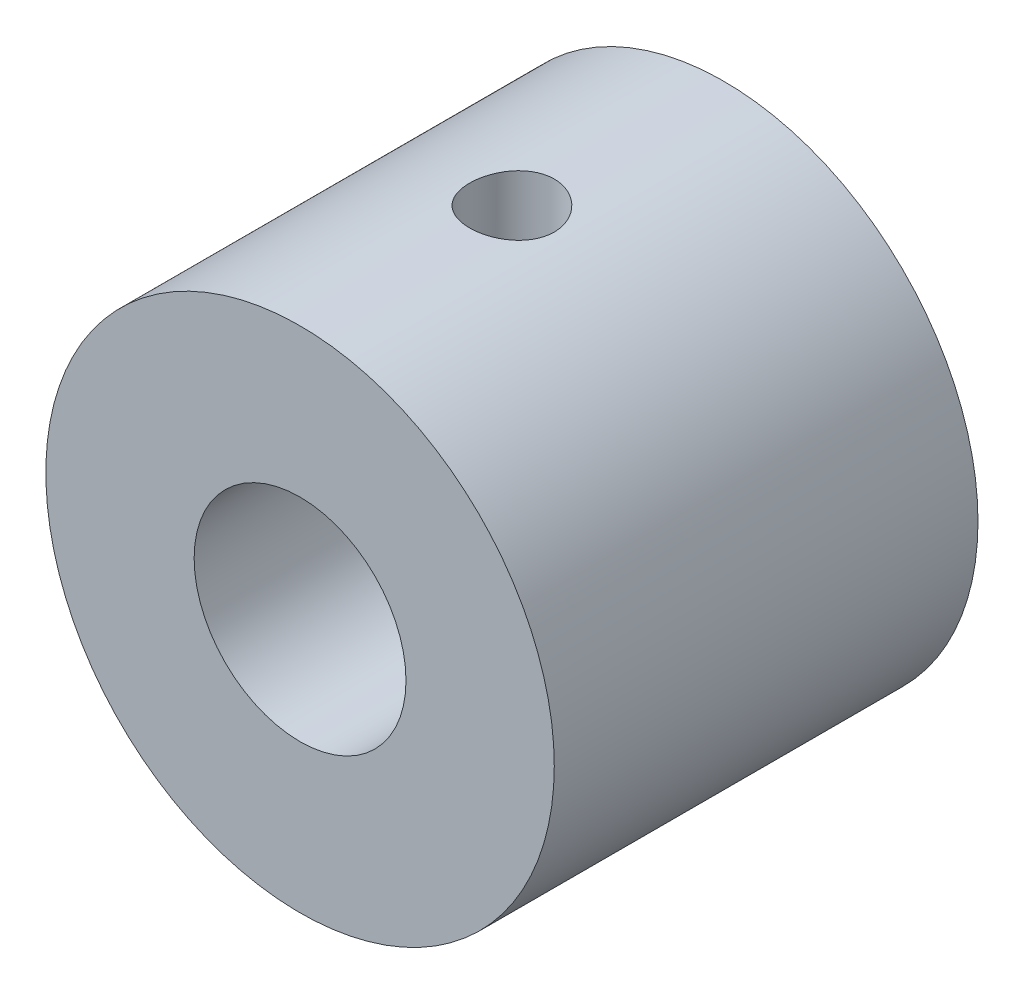
ISO-10303-21;
HEADER;
FILE_DESCRIPTION(('STEP AP214'),'2;1');
FILE_NAME('part.step','',(''),(''),'','','');
FILE_SCHEMA(('AUTOMOTIVE_DESIGN { 1 0 10303 214 1 1 1 1 }'));
ENDSEC;
DATA;
#1=APPLICATION_CONTEXT('core data for automotive mechanical design processes');
#2=APPLICATION_PROTOCOL_DEFINITION('international standard','automotive_design',2000,#1);
#3=PRODUCT_CONTEXT('',#1,'mechanical');
#4=PRODUCT('Part','Part','',(#3));
#5=PRODUCT_RELATED_PRODUCT_CATEGORY('part','',(#4));
#6=PRODUCT_DEFINITION_FORMATION('','',#4);
#7=PRODUCT_DEFINITION_CONTEXT('part definition',#1,'design');
#8=PRODUCT_DEFINITION('design','',#6,#7);
#9=PRODUCT_DEFINITION_SHAPE('','',#8);
#10=(LENGTH_UNIT() NAMED_UNIT(*) SI_UNIT(.MILLI.,.METRE.));
#11=(NAMED_UNIT(*) PLANE_ANGLE_UNIT() SI_UNIT($,.RADIAN.));
#12=(NAMED_UNIT(*) SI_UNIT($,.STERADIAN.) SOLID_ANGLE_UNIT());
#13=UNCERTAINTY_MEASURE_WITH_UNIT(LENGTH_MEASURE(1.E-05),#10,'distance_accuracy_value','');
#14=(GEOMETRIC_REPRESENTATION_CONTEXT(3) GLOBAL_UNCERTAINTY_ASSIGNED_CONTEXT((#13)) GLOBAL_UNIT_ASSIGNED_CONTEXT((#10,
#11,#12)) REPRESENTATION_CONTEXT('',''));
#15=CARTESIAN_POINT('',(0.,0.,0.));
#16=DIRECTION('',(0.,0.,1.));
#17=DIRECTION('',(1.,0.,0.));
#18=AXIS2_PLACEMENT_3D('',#15,#16,#17);
#19=CARTESIAN_POINT('',(0.,0.,10.));
#20=DIRECTION('',(0.,0.,-1.));
#21=DIRECTION('',(-1.,0.,0.));
#22=AXIS2_PLACEMENT_3D('',#19,#20,#21);
#23=CYLINDRICAL_SURFACE('',#22,6.);
#24=CARTESIAN_POINT('',(0.,0.,10.));
#25=DIRECTION('',(0.,0.,1.));
#26=DIRECTION('',(1.,0.,0.));
#27=AXIS2_PLACEMENT_3D('',#24,#25,#26);
#28=CIRCLE('',#27,6.);
#29=CARTESIAN_POINT('',(6.,0.,10.));
#30=VERTEX_POINT('',#29);
#31=EDGE_CURVE('E10',#30,#30,#28,.T.);
#32=ORIENTED_EDGE('',*,*,#31,.F.);
#33=EDGE_LOOP('',(#32));
#34=FACE_BOUND('',#33,.T.);
#35=CARTESIAN_POINT('',(0.,0.,0.));
#36=DIRECTION('',(0.,0.,1.));
#37=DIRECTION('',(1.,0.,0.));
#38=AXIS2_PLACEMENT_3D('',#35,#36,#37);
#39=CIRCLE('',#38,6.);
#40=CARTESIAN_POINT('',(6.,0.,0.));
#41=VERTEX_POINT('',#40);
#42=EDGE_CURVE('E45',#41,#41,#39,.T.);
#43=ORIENTED_EDGE('',*,*,#42,.T.);
#44=EDGE_LOOP('',(#43));
#45=FACE_BOUND('',#44,.T.);
#46=CARTESIAN_POINT('',(0.,-6.,4.));
#47=CARTESIAN_POINT('',(0.0557563619832858,-5.9999990446753,4.00000223557913));
#48=CARTESIAN_POINT('',(0.111543152735528,-5.99921471165214,4.00467890998757));
#49=CARTESIAN_POINT('',(0.221552088669217,-5.99616137976555,4.02325426350613));
#50=CARTESIAN_POINT('',(0.275772747183699,-5.99389101569556,4.03716142276464));
#51=CARTESIAN_POINT('',(0.381041898885057,-5.9881202729458,4.0737661794371));
#52=CARTESIAN_POINT('',(0.43209294737276,-5.98462090063677,4.09645658625623));
#53=CARTESIAN_POINT('',(0.529656736791178,-5.97677690832828,4.14996491682096));
#54=CARTESIAN_POINT('',(0.576169995951436,-5.97243238501774,4.1807819109932));
#55=CARTESIAN_POINT('',(0.663789045716672,-5.96333326983325,4.24998203352818));
#56=CARTESIAN_POINT('',(0.704845161413987,-5.95857548725943,4.28842764585445));
#57=CARTESIAN_POINT('',(0.779955399463971,-5.94921050750693,4.37165918738912));
#58=CARTESIAN_POINT('',(0.814009079756389,-5.94460331985067,4.41644551658264));
#59=CARTESIAN_POINT('',(0.874346850242053,-5.93603026303912,4.51142838647882));
#60=CARTESIAN_POINT('',(0.9005818211444,-5.93206851636655,4.5616565347219));
#61=CARTESIAN_POINT('',(0.944223346164487,-5.9252791591787,4.66588382572025));
#62=CARTESIAN_POINT('',(0.961630496626245,-5.92245147205723,4.71988271347105));
#63=CARTESIAN_POINT('',(0.986965751113923,-5.91828214737102,4.82959210994261));
#64=CARTESIAN_POINT('',(0.994979611654161,-5.9169270739428,4.88528229460056));
#65=CARTESIAN_POINT('',(1.00156669011595,-5.9158157557466,4.99723211075339));
#66=CARTESIAN_POINT('',(1.0001405761556,-5.91605939782886,5.05349170166692));
#67=CARTESIAN_POINT('',(0.987958039358461,-5.91810571545422,5.16437114451018));
#68=CARTESIAN_POINT('',(0.977297952755909,-5.91989229327567,5.21900192141809));
#69=CARTESIAN_POINT('',(0.947101256161378,-5.92479798084403,5.32568852713165));
#70=CARTESIAN_POINT('',(0.927564341727897,-5.92791713629309,5.37774426755542));
#71=CARTESIAN_POINT('',(0.880070898437566,-5.9351539173364,5.47809152937637));
#72=CARTESIAN_POINT('',(0.852074365551886,-5.9392762684293,5.52636376243249));
#73=CARTESIAN_POINT('',(0.788484807022974,-5.94805167366004,5.61756176021535));
#74=CARTESIAN_POINT('',(0.752891168261716,-5.95270477061714,5.66048709298197));
#75=CARTESIAN_POINT('',(0.674592884863622,-5.96208811151914,5.74033043432294));
#76=CARTESIAN_POINT('',(0.631805585549251,-5.96681859692661,5.77716740741603));
#77=CARTESIAN_POINT('',(0.540614099592659,-5.97577040558689,5.84315110506614));
#78=CARTESIAN_POINT('',(0.492209876762569,-5.97999172555898,5.87229778007329));
#79=CARTESIAN_POINT('',(0.391082366466685,-5.98745557157165,5.92208089085451));
#80=CARTESIAN_POINT('',(0.338355490225865,-5.99069727362979,5.9427101677325));
#81=CARTESIAN_POINT('',(0.230119338241093,-5.99583001205064,5.97479768609839));
#82=CARTESIAN_POINT('',(0.174610295671788,-5.9977211614019,5.98625669478949));
#83=CARTESIAN_POINT('',(0.06308396052065,-5.99992451937074,5.99956854338445));
#84=CARTESIAN_POINT('',(0.00708029486040516,-6.00025501205114,6.00153262872224));
#85=CARTESIAN_POINT('',(-0.104455909155954,-5.99934989768468,5.99609546222875));
#86=CARTESIAN_POINT('',(-0.159988465556815,-5.99811435089647,5.98869457074651));
#87=CARTESIAN_POINT('',(-0.268662470218705,-5.99422730775281,5.96483006026581));
#88=CARTESIAN_POINT('',(-0.321816347354151,-5.99158441920525,5.94842151664395));
#89=CARTESIAN_POINT('',(-0.424618753944176,-5.98517785782144,5.90706619272019));
#90=CARTESIAN_POINT('',(-0.474267086363887,-5.98141412204808,5.88211893294589));
#91=CARTESIAN_POINT('',(-0.569132275787583,-5.97313806520963,5.82413955012129));
#92=CARTESIAN_POINT('',(-0.614306100374859,-5.96861942354809,5.7910379375331));
#93=CARTESIAN_POINT('',(-0.698497434201075,-5.9593538695676,5.71778507384598));
#94=CARTESIAN_POINT('',(-0.737514495878633,-5.95460694068619,5.67763331068933));
#95=CARTESIAN_POINT('',(-0.8086971118632,-5.94536070094338,5.59092098077143));
#96=CARTESIAN_POINT('',(-0.840787504445485,-5.94086446454842,5.54429833379424));
#97=CARTESIAN_POINT('',(-0.896680924117993,-5.93268611911154,5.44625881234459));
#98=CARTESIAN_POINT('',(-0.920484213907928,-5.92900398426408,5.394842089909));
#99=CARTESIAN_POINT('',(-0.959015332589259,-5.92289381479082,5.28888410687515));
#100=CARTESIAN_POINT('',(-0.973780573019178,-5.92046061724426,5.23435676198781));
#101=CARTESIAN_POINT('',(-0.993934181511311,-5.91711086734105,5.1235519483113));
#102=CARTESIAN_POINT('',(-0.999323364778467,-5.91619418313089,5.06727463210718));
#103=CARTESIAN_POINT('',(-1.00054914641894,-5.91598693233605,4.95531793361504));
#104=CARTESIAN_POINT('',(-0.996504054450075,-5.9166762260226,4.89963984856988));
#105=CARTESIAN_POINT('',(-0.979231935582739,-5.91955912581491,4.78976830077969));
#106=CARTESIAN_POINT('',(-0.966004938444991,-5.92175272704486,4.73557483322325));
#107=CARTESIAN_POINT('',(-0.930789795837961,-5.92738942512688,4.63025662508296));
#108=CARTESIAN_POINT('',(-0.908811836240177,-5.93083106887868,4.57912839597759));
#109=CARTESIAN_POINT('',(-0.856730801566364,-5.93857747568883,4.48126573232206));
#110=CARTESIAN_POINT('',(-0.826627323499425,-5.9428822815536,4.43453151585115));
#111=CARTESIAN_POINT('',(-0.758727553748862,-5.95193381618249,4.3461857667569));
#112=CARTESIAN_POINT('',(-0.720844225437459,-5.95668518230521,4.30464159331989));
#113=CARTESIAN_POINT('',(-0.638643612552092,-5.96605748944336,4.22845935821003));
#114=CARTESIAN_POINT('',(-0.594324845165055,-5.97067840010619,4.19382289254473));
#115=CARTESIAN_POINT('',(-0.500147667856113,-5.97930611856888,4.13222069272002));
#116=CARTESIAN_POINT('',(-0.450253115013128,-5.98330846501242,4.10530958427482));
#117=CARTESIAN_POINT('',(-0.346605227751593,-5.9902046704071,4.06029220615603));
#118=CARTESIAN_POINT('',(-0.292855797932005,-5.99309963270993,4.04217716756812));
#119=CARTESIAN_POINT('',(-0.199081324018161,-5.99682316333182,4.01919789034933));
#120=CARTESIAN_POINT('',(-0.159623532119379,-5.99800810909344,4.01201021215361));
#121=CARTESIAN_POINT('',(-0.0801157241279235,-5.99959686394448,4.0024105048621));
#122=CARTESIAN_POINT('',(-0.0400657182433977,-6.00000068648257,3.99999839354506));
#123=CARTESIAN_POINT('',(0.,-6.,4.));
#124=B_SPLINE_CURVE_WITH_KNOTS('',3,(#46,#47,#48,#49,#50,#51,#52,#53,#54,#55,#56,#57,#58,#59,
#60,#61,#62,#63,#64,#65,#66,#67,#68,#69,#70,#71,#72,#73,#74,#75,#76,#77,#78,#79,#80,#81,#82,#83,
#84,#85,#86,#87,#88,#89,#90,#91,#92,#93,#94,#95,#96,#97,#98,#99,#100,#101,#102,#103,#104,#105,
#106,#107,#108,#109,#110,#111,#112,#113,#114,#115,#116,#117,#118,#119,#120,#121,#122,#123),
.UNSPECIFIED.,.T.,.F.,(4,2,2,2,2,2,2,2,2,2,2,2,2,2,2,2,2,2,2,2,2,2,2,2,2,2,2,2,2,2,2,2,2,2,2,2,
2,2,4),(0.,0.167122633975404,0.334399018278168,0.501538746810107,0.668659365069916,
0.837209964249329,1.00577120067943,1.17537008329536,1.34495750750472,1.51298430841369,
1.68099921728354,1.84728208704163,2.01357066010152,2.18065822653023,2.34775928272229,
2.51693107964531,2.68610396654339,2.85541875566361,3.02471937808459,3.19203153396559,
3.35933725214344,3.52563122802566,3.69193454330427,3.8597073025081,4.02749225221713,
4.19701528803048,4.36653294950377,4.53534408936709,4.70414055114647,4.8708316380908,
5.03752218475253,5.20401927290489,5.37052462011734,5.53900553677357,5.70752533551589,
5.8772089264288,6.04672300852029,6.16681699265607,6.28690890910787),.UNSPECIFIED.);
#125=CARTESIAN_POINT('',(0.,-6.,4.));
#126=VERTEX_POINT('',#125);
#127=EDGE_CURVE('E73',#126,#126,#124,.T.);
#128=ORIENTED_EDGE('',*,*,#127,.F.);
#129=EDGE_LOOP('',(#128));
#130=FACE_BOUND('',#129,.T.);
#131=CARTESIAN_POINT('',(0.,6.,4.));
#132=CARTESIAN_POINT('',(-0.0557563619832858,5.9999990446753,4.00000223557913));
#133=CARTESIAN_POINT('',(-0.111543152735528,5.99921471165214,4.00467890998757));
#134=CARTESIAN_POINT('',(-0.221552088669217,5.99616137976555,4.02325426350613));
#135=CARTESIAN_POINT('',(-0.275772747183699,5.99389101569556,4.03716142276464));
#136=CARTESIAN_POINT('',(-0.381041898885057,5.9881202729458,4.0737661794371));
#137=CARTESIAN_POINT('',(-0.43209294737276,5.98462090063677,4.09645658625623));
#138=CARTESIAN_POINT('',(-0.529656736791178,5.97677690832828,4.14996491682096));
#139=CARTESIAN_POINT('',(-0.576169995951436,5.97243238501774,4.1807819109932));
#140=CARTESIAN_POINT('',(-0.663789045716672,5.96333326983325,4.24998203352818));
#141=CARTESIAN_POINT('',(-0.704845161413987,5.95857548725943,4.28842764585445));
#142=CARTESIAN_POINT('',(-0.779955399463971,5.94921050750693,4.37165918738912));
#143=CARTESIAN_POINT('',(-0.814009079756389,5.94460331985067,4.41644551658264));
#144=CARTESIAN_POINT('',(-0.874346850242053,5.93603026303912,4.51142838647882));
#145=CARTESIAN_POINT('',(-0.9005818211444,5.93206851636655,4.5616565347219));
#146=CARTESIAN_POINT('',(-0.944223346164487,5.9252791591787,4.66588382572025));
#147=CARTESIAN_POINT('',(-0.961630496626245,5.92245147205723,4.71988271347105));
#148=CARTESIAN_POINT('',(-0.986965751113923,5.91828214737102,4.82959210994261));
#149=CARTESIAN_POINT('',(-0.994979611654161,5.9169270739428,4.88528229460056));
#150=CARTESIAN_POINT('',(-1.00156669011595,5.9158157557466,4.99723211075339));
#151=CARTESIAN_POINT('',(-1.0001405761556,5.91605939782886,5.05349170166692));
#152=CARTESIAN_POINT('',(-0.987958039358461,5.91810571545422,5.16437114451018));
#153=CARTESIAN_POINT('',(-0.977297952755909,5.91989229327567,5.21900192141809));
#154=CARTESIAN_POINT('',(-0.947101256161378,5.92479798084403,5.32568852713165));
#155=CARTESIAN_POINT('',(-0.927564341727897,5.92791713629309,5.37774426755542));
#156=CARTESIAN_POINT('',(-0.880070898437566,5.9351539173364,5.47809152937637));
#157=CARTESIAN_POINT('',(-0.852074365551886,5.9392762684293,5.52636376243249));
#158=CARTESIAN_POINT('',(-0.788484807022974,5.94805167366004,5.61756176021535));
#159=CARTESIAN_POINT('',(-0.752891168261716,5.95270477061714,5.66048709298197));
#160=CARTESIAN_POINT('',(-0.674592884863622,5.96208811151914,5.74033043432294));
#161=CARTESIAN_POINT('',(-0.631805585549251,5.96681859692661,5.77716740741603));
#162=CARTESIAN_POINT('',(-0.540614099592659,5.97577040558689,5.84315110506614));
#163=CARTESIAN_POINT('',(-0.492209876762569,5.97999172555898,5.87229778007329));
#164=CARTESIAN_POINT('',(-0.391082366466685,5.98745557157165,5.92208089085451));
#165=CARTESIAN_POINT('',(-0.338355490225865,5.99069727362979,5.9427101677325));
#166=CARTESIAN_POINT('',(-0.230119338241093,5.99583001205064,5.97479768609839));
#167=CARTESIAN_POINT('',(-0.174610295671788,5.9977211614019,5.98625669478949));
#168=CARTESIAN_POINT('',(-0.06308396052065,5.99992451937074,5.99956854338445));
#169=CARTESIAN_POINT('',(-0.00708029486040516,6.00025501205114,6.00153262872224));
#170=CARTESIAN_POINT('',(0.104455909155954,5.99934989768468,5.99609546222875));
#171=CARTESIAN_POINT('',(0.159988465556815,5.99811435089647,5.98869457074651));
#172=CARTESIAN_POINT('',(0.268662470218705,5.99422730775281,5.96483006026581));
#173=CARTESIAN_POINT('',(0.321816347354151,5.99158441920525,5.94842151664395));
#174=CARTESIAN_POINT('',(0.424618753944176,5.98517785782144,5.90706619272019));
#175=CARTESIAN_POINT('',(0.474267086363887,5.98141412204808,5.88211893294589));
#176=CARTESIAN_POINT('',(0.569132275787583,5.97313806520963,5.82413955012129));
#177=CARTESIAN_POINT('',(0.614306100374859,5.96861942354809,5.7910379375331));
#178=CARTESIAN_POINT('',(0.698497434201075,5.9593538695676,5.71778507384598));
#179=CARTESIAN_POINT('',(0.737514495878633,5.95460694068619,5.67763331068933));
#180=CARTESIAN_POINT('',(0.8086971118632,5.94536070094338,5.59092098077143));
#181=CARTESIAN_POINT('',(0.840787504445485,5.94086446454842,5.54429833379424));
#182=CARTESIAN_POINT('',(0.896680924117993,5.93268611911154,5.44625881234459));
#183=CARTESIAN_POINT('',(0.920484213907928,5.92900398426408,5.394842089909));
#184=CARTESIAN_POINT('',(0.959015332589259,5.92289381479082,5.28888410687515));
#185=CARTESIAN_POINT('',(0.973780573019178,5.92046061724426,5.23435676198781));
#186=CARTESIAN_POINT('',(0.993934181511311,5.91711086734105,5.1235519483113));
#187=CARTESIAN_POINT('',(0.999323364778467,5.91619418313089,5.06727463210718));
#188=CARTESIAN_POINT('',(1.00054914641894,5.91598693233605,4.95531793361504));
#189=CARTESIAN_POINT('',(0.996504054450075,5.9166762260226,4.89963984856988));
#190=CARTESIAN_POINT('',(0.979231935582739,5.91955912581491,4.78976830077969));
#191=CARTESIAN_POINT('',(0.966004938444991,5.92175272704486,4.73557483322325));
#192=CARTESIAN_POINT('',(0.930789795837961,5.92738942512688,4.63025662508296));
#193=CARTESIAN_POINT('',(0.908811836240177,5.93083106887868,4.57912839597759));
#194=CARTESIAN_POINT('',(0.856730801566364,5.93857747568883,4.48126573232206));
#195=CARTESIAN_POINT('',(0.826627323499425,5.9428822815536,4.43453151585115));
#196=CARTESIAN_POINT('',(0.758727553748862,5.95193381618249,4.3461857667569));
#197=CARTESIAN_POINT('',(0.720844225437459,5.95668518230521,4.30464159331989));
#198=CARTESIAN_POINT('',(0.638643612552092,5.96605748944336,4.22845935821003));
#199=CARTESIAN_POINT('',(0.594324845165055,5.97067840010619,4.19382289254473));
#200=CARTESIAN_POINT('',(0.500147667856113,5.97930611856888,4.13222069272002));
#201=CARTESIAN_POINT('',(0.450253115013128,5.98330846501242,4.10530958427482));
#202=CARTESIAN_POINT('',(0.346605227751593,5.9902046704071,4.06029220615603));
#203=CARTESIAN_POINT('',(0.292855797932005,5.99309963270993,4.04217716756812));
#204=CARTESIAN_POINT('',(0.199081324018161,5.99682316333182,4.01919789034933));
#205=CARTESIAN_POINT('',(0.159623532119379,5.99800810909344,4.01201021215361));
#206=CARTESIAN_POINT('',(0.0801157241279235,5.99959686394448,4.0024105048621));
#207=CARTESIAN_POINT('',(0.0400657182433977,6.00000068648257,3.99999839354506));
#208=CARTESIAN_POINT('',(0.,6.,4.));
#209=B_SPLINE_CURVE_WITH_KNOTS('',3,(#131,#132,#133,#134,#135,#136,#137,#138,#139,#140,#141,
#142,#143,#144,#145,#146,#147,#148,#149,#150,#151,#152,#153,#154,#155,#156,#157,#158,#159,#160,
#161,#162,#163,#164,#165,#166,#167,#168,#169,#170,#171,#172,#173,#174,#175,#176,#177,#178,#179,
#180,#181,#182,#183,#184,#185,#186,#187,#188,#189,#190,#191,#192,#193,#194,#195,#196,#197,#198,
#199,#200,#201,#202,#203,#204,#205,#206,#207,#208),.UNSPECIFIED.,.T.,.F.,(4,2,2,2,2,2,2,2,2,2,2,
2,2,2,2,2,2,2,2,2,2,2,2,2,2,2,2,2,2,2,2,2,2,2,2,2,2,2,4),(0.,0.167122633975404,
0.334399018278168,0.501538746810107,0.668659365069916,0.837209964249329,1.00577120067943,
1.17537008329536,1.34495750750472,1.51298430841369,1.68099921728354,1.84728208704163,
2.01357066010152,2.18065822653023,2.34775928272229,2.51693107964531,2.68610396654339,
2.85541875566361,3.02471937808459,3.19203153396559,3.35933725214344,3.52563122802566,
3.69193454330427,3.8597073025081,4.02749225221713,4.19701528803048,4.36653294950377,
4.53534408936709,4.70414055114647,4.8708316380908,5.03752218475253,5.20401927290489,
5.37052462011734,5.53900553677357,5.70752533551589,5.8772089264288,6.04672300852029,
6.16681699265607,6.28690890910787),.UNSPECIFIED.);
#210=CARTESIAN_POINT('',(0.,6.,4.));
#211=VERTEX_POINT('',#210);
#212=EDGE_CURVE('E78',#211,#211,#209,.T.);
#213=ORIENTED_EDGE('',*,*,#212,.F.);
#214=EDGE_LOOP('',(#213));
#215=FACE_BOUND('',#214,.T.);
#216=ADVANCED_FACE('F32',(#34,#45,#130,#215),#23,.T.);
#217=CARTESIAN_POINT('',(0.,0.,10.));
#218=DIRECTION('',(0.,0.,-1.));
#219=DIRECTION('',(-1.,0.,0.));
#220=AXIS2_PLACEMENT_3D('',#217,#218,#219);
#221=CYLINDRICAL_SURFACE('',#220,2.5);
#222=CARTESIAN_POINT('',(0.,-2.5,4.));
#223=CARTESIAN_POINT('',(0.0537465027214457,-2.49999635613542,4.00000492591186));
#224=CARTESIAN_POINT('',(0.107586282045337,-2.49824647153466,4.00435887604419));
#225=CARTESIAN_POINT('',(0.213748240208948,-2.49141726550321,4.02162385176062));
#226=CARTESIAN_POINT('',(0.266065888780624,-2.48632889349439,4.03455813954307));
#227=CARTESIAN_POINT('',(0.367476961363701,-2.47337104606559,4.06843803902942));
#228=CARTESIAN_POINT('',(0.416580330808479,-2.46551068182036,4.08935742310836));
#229=CARTESIAN_POINT('',(0.510535985164184,-2.44778305398039,4.13850958666327));
#230=CARTESIAN_POINT('',(0.555389738375496,-2.43791648729028,4.16673982745947));
#231=CARTESIAN_POINT('',(0.641750503785196,-2.41665443085209,4.23111774928047));
#232=CARTESIAN_POINT('',(0.683031136275106,-2.40521148464595,4.26755332812013));
#233=CARTESIAN_POINT('',(0.759087502392361,-2.38230288453097,4.34670000173839));
#234=CARTESIAN_POINT('',(0.793860053566766,-2.37083722226896,4.38941414860587));
#235=CARTESIAN_POINT('',(0.857437283646439,-2.34861395898568,4.48221403512113));
#236=CARTESIAN_POINT('',(0.885907490597736,-2.33791057982476,4.5325432430116));
#237=CARTESIAN_POINT('',(0.933877359518574,-2.31916823593396,4.63776819921002));
#238=CARTESIAN_POINT('',(0.953381282142917,-2.31112800622088,4.69266176392418));
#239=CARTESIAN_POINT('',(0.981949411697933,-2.29913178830409,4.80285616679605));
#240=CARTESIAN_POINT('',(0.991446982902824,-2.29500710177803,4.85802561778811));
#241=CARTESIAN_POINT('',(1.00108648082001,-2.29082002024572,4.96931749915363));
#242=CARTESIAN_POINT('',(1.00123300815661,-2.29075562761384,5.02543944731251));
#243=CARTESIAN_POINT('',(0.992494683752272,-2.29455250139997,5.13287833572902));
#244=CARTESIAN_POINT('',(0.984237657152568,-2.29814087519225,5.18425785720452));
#245=CARTESIAN_POINT('',(0.95997344014891,-2.30838093803918,5.28482977800336));
#246=CARTESIAN_POINT('',(0.943964897402315,-2.31503316160837,5.33402179405515));
#247=CARTESIAN_POINT('',(0.904347366275536,-2.33079742544265,5.43000891809802));
#248=CARTESIAN_POINT('',(0.880589931157659,-2.33995689640394,5.47673461952734));
#249=CARTESIAN_POINT('',(0.826253230366107,-2.35969058194945,5.56570790818078));
#250=CARTESIAN_POINT('',(0.795671402550422,-2.37026532728424,5.6079538047014));
#251=CARTESIAN_POINT('',(0.725775299727216,-2.39263368371135,5.690204864401));
#252=CARTESIAN_POINT('',(0.685968731485317,-2.40445832488076,5.72978436472301));
#253=CARTESIAN_POINT('',(0.600157213715096,-2.42729912479141,5.80184223900102));
#254=CARTESIAN_POINT('',(0.554151032667217,-2.43831512222662,5.83431919870515));
#255=CARTESIAN_POINT('',(0.456038826302922,-2.45857340632274,5.89180872370792));
#256=CARTESIAN_POINT('',(0.403830245673239,-2.46777635047707,5.91666114059853));
#257=CARTESIAN_POINT('',(0.295511882741441,-2.4830741416438,5.95708393053903));
#258=CARTESIAN_POINT('',(0.239404098424837,-2.48917056731191,5.9726590187787));
#259=CARTESIAN_POINT('',(0.12844794380391,-2.49728069753455,5.99322414770985));
#260=CARTESIAN_POINT('',(0.0737216469927675,-2.49951472916757,5.99878622712678));
#261=CARTESIAN_POINT('',(-0.0359226549039086,-2.50034239255316,6.00085655026431));
#262=CARTESIAN_POINT('',(-0.0908406066119619,-2.49893696791146,5.99736714077375));
#263=CARTESIAN_POINT('',(-0.196716369560994,-2.49278783531877,5.981854123724));
#264=CARTESIAN_POINT('',(-0.247741245887737,-2.48819695672762,5.97022100982451));
#265=CARTESIAN_POINT('',(-0.34706771403039,-2.4762972070275,5.93928214584509));
#266=CARTESIAN_POINT('',(-0.395368955112422,-2.46898798678265,5.91997541016566));
#267=CARTESIAN_POINT('',(-0.489539392908351,-2.45208297385406,5.87360753016003));
#268=CARTESIAN_POINT('',(-0.535289011377703,-2.44242407989902,5.84632726397843));
#269=CARTESIAN_POINT('',(-0.621721795623278,-2.42186682372762,5.78502983804718));
#270=CARTESIAN_POINT('',(-0.662402920380563,-2.41096796555135,5.75100997853869));
#271=CARTESIAN_POINT('',(-0.740361521514409,-2.38822558819056,5.67456499352519));
#272=CARTESIAN_POINT('',(-0.777236966903032,-2.37636720712526,5.6317332292469));
#273=CARTESIAN_POINT('',(-0.843375598706855,-2.35370836458566,5.54027995849532));
#274=CARTESIAN_POINT('',(-0.872637530668754,-2.34290807763255,5.49165749983003));
#275=CARTESIAN_POINT('',(-0.922903750965813,-2.32357149953854,5.38926915270295));
#276=CARTESIAN_POINT('',(-0.943825297267227,-2.31505815442394,5.33545800039384));
#277=CARTESIAN_POINT('',(-0.976148109852652,-2.30161836738966,5.22463317414242));
#278=CARTESIAN_POINT('',(-0.987556402634658,-2.29668927847999,5.16762189709379));
#279=CARTESIAN_POINT('',(-0.999857808639201,-2.29135879649963,5.05643604911273));
#280=CARTESIAN_POINT('',(-1.00144854115143,-2.29065710504086,5.00235258020332));
#281=CARTESIAN_POINT('',(-0.995901579638762,-2.29307418016549,4.89472757114335));
#282=CARTESIAN_POINT('',(-0.988764993956891,-2.29619246162397,4.84118596304871));
#283=CARTESIAN_POINT('',(-0.966535683076824,-2.3056332453951,4.73833390507248));
#284=CARTESIAN_POINT('',(-0.951768746785489,-2.31182415913725,4.6889398627835));
#285=CARTESIAN_POINT('',(-0.915002724245506,-2.32662000616348,4.59331068519326));
#286=CARTESIAN_POINT('',(-0.893001640696906,-2.33522560603003,4.54707642655009));
#287=CARTESIAN_POINT('',(-0.840936381379865,-2.35449304802246,4.45619519036461));
#288=CARTESIAN_POINT('',(-0.810482667579745,-2.36524441156621,4.41179066493476));
#289=CARTESIAN_POINT('',(-0.742946059635748,-2.38731902186119,4.32850334139812));
#290=CARTESIAN_POINT('',(-0.705861167409061,-2.39864244024203,4.28962221393584));
#291=CARTESIAN_POINT('',(-0.623252753136231,-2.42146783543697,4.21589857336819));
#292=CARTESIAN_POINT('',(-0.577338000573069,-2.43293378981093,4.18148134655097));
#293=CARTESIAN_POINT('',(-0.479950160142889,-2.45400203356858,4.12083147868918));
#294=CARTESIAN_POINT('',(-0.428474502273619,-2.46360345546453,4.09460264392374));
#295=CARTESIAN_POINT('',(-0.322369031247601,-2.47969857407931,4.05168889240486));
#296=CARTESIAN_POINT('',(-0.267815809109847,-2.48624681527514,4.03483533821983));
#297=CARTESIAN_POINT('',(-0.15643827314061,-2.49572153104683,4.01068043952287));
#298=CARTESIAN_POINT('',(-0.0996217629294557,-2.49865949747819,4.00334878162805));
#299=CARTESIAN_POINT('',(-0.0284561489454644,-2.49987949752068,4.00030230951086));
#300=CARTESIAN_POINT('',(-0.014231344370379,-2.50000096484588,3.9999986956854));
#301=CARTESIAN_POINT('',(0.,-2.5,4.));
#302=B_SPLINE_CURVE_WITH_KNOTS('',3,(#222,#223,#224,#225,#226,#227,#228,#229,#230,#231,#232,
#233,#234,#235,#236,#237,#238,#239,#240,#241,#242,#243,#244,#245,#246,#247,#248,#249,#250,#251,
#252,#253,#254,#255,#256,#257,#258,#259,#260,#261,#262,#263,#264,#265,#266,#267,#268,#269,#270,
#271,#272,#273,#274,#275,#276,#277,#278,#279,#280,#281,#282,#283,#284,#285,#286,#287,#288,#289,
#290,#291,#292,#293,#294,#295,#296,#297,#298,#299,#300,#301),.UNSPECIFIED.,.T.,.F.,(4,2,2,2,2,2,
2,2,2,2,2,2,2,2,2,2,2,2,2,2,2,2,2,2,2,2,2,2,2,2,2,2,2,2,2,2,2,2,2,4),(0.,0.161201493946536,
0.322841818003967,0.48395572873579,0.645013767839921,0.812986908501985,0.981041974672057,
1.15657629409608,1.33202711559134,1.49952052654414,1.66693153170244,1.82269164200686,
1.97847893628024,2.13744563149408,2.29647210969092,2.46779174593278,2.63914546419866,
2.81388456581403,2.98853478056895,3.15284592264004,3.31711446785041,3.47400227782183,
3.63091024496898,3.79261756699131,3.95438979749484,4.12684237312207,4.29932334521874,
4.47347522570414,4.64749836322967,4.80899836696374,4.97047786281523,5.12557159274385,
5.28070817902581,5.44472734028346,5.60879600674197,5.78350211766918,5.95828931820266,
6.12982150506659,6.30080626202171,6.34349022948398),.UNSPECIFIED.);
#303=CARTESIAN_POINT('',(0.,-2.5,4.));
#304=VERTEX_POINT('',#303);
#305=EDGE_CURVE('E55',#304,#304,#302,.T.);
#306=ORIENTED_EDGE('',*,*,#305,.T.);
#307=EDGE_LOOP('',(#306));
#308=FACE_BOUND('',#307,.T.);
#309=CARTESIAN_POINT('',(0.,0.,10.));
#310=DIRECTION('',(0.,0.,1.));
#311=DIRECTION('',(1.,0.,0.));
#312=AXIS2_PLACEMENT_3D('',#309,#310,#311);
#313=CIRCLE('',#312,2.5);
#314=CARTESIAN_POINT('',(2.5,0.,10.));
#315=VERTEX_POINT('',#314);
#316=EDGE_CURVE('E50',#315,#315,#313,.T.);
#317=ORIENTED_EDGE('',*,*,#316,.T.);
#318=EDGE_LOOP('',(#317));
#319=FACE_BOUND('',#318,.T.);
#320=CARTESIAN_POINT('',(0.,0.,0.));
#321=DIRECTION('',(0.,0.,1.));
#322=DIRECTION('',(1.,0.,0.));
#323=AXIS2_PLACEMENT_3D('',#320,#321,#322);
#324=CIRCLE('',#323,2.5);
#325=CARTESIAN_POINT('',(2.5,0.,0.));
#326=VERTEX_POINT('',#325);
#327=EDGE_CURVE('E53',#326,#326,#324,.T.);
#328=ORIENTED_EDGE('',*,*,#327,.F.);
#329=EDGE_LOOP('',(#328));
#330=FACE_BOUND('',#329,.T.);
#331=CARTESIAN_POINT('',(0.,2.5,4.));
#332=CARTESIAN_POINT('',(-0.0537465027214457,2.49999635613542,4.00000492591186));
#333=CARTESIAN_POINT('',(-0.107586282045337,2.49824647153466,4.00435887604419));
#334=CARTESIAN_POINT('',(-0.213748240208948,2.49141726550321,4.02162385176062));
#335=CARTESIAN_POINT('',(-0.266065888780624,2.48632889349439,4.03455813954307));
#336=CARTESIAN_POINT('',(-0.367476961363701,2.47337104606559,4.06843803902942));
#337=CARTESIAN_POINT('',(-0.416580330808479,2.46551068182036,4.08935742310836));
#338=CARTESIAN_POINT('',(-0.510535985164184,2.44778305398039,4.13850958666327));
#339=CARTESIAN_POINT('',(-0.555389738375496,2.43791648729028,4.16673982745947));
#340=CARTESIAN_POINT('',(-0.641750503785196,2.41665443085209,4.23111774928047));
#341=CARTESIAN_POINT('',(-0.683031136275106,2.40521148464595,4.26755332812013));
#342=CARTESIAN_POINT('',(-0.759087502392361,2.38230288453097,4.34670000173839));
#343=CARTESIAN_POINT('',(-0.793860053566766,2.37083722226896,4.38941414860587));
#344=CARTESIAN_POINT('',(-0.857437283646439,2.34861395898568,4.48221403512113));
#345=CARTESIAN_POINT('',(-0.885907490597736,2.33791057982476,4.5325432430116));
#346=CARTESIAN_POINT('',(-0.933877359518574,2.31916823593396,4.63776819921002));
#347=CARTESIAN_POINT('',(-0.953381282142917,2.31112800622088,4.69266176392418));
#348=CARTESIAN_POINT('',(-0.981949411697933,2.29913178830409,4.80285616679605));
#349=CARTESIAN_POINT('',(-0.991446982902824,2.29500710177803,4.85802561778811));
#350=CARTESIAN_POINT('',(-1.00108648082001,2.29082002024572,4.96931749915363));
#351=CARTESIAN_POINT('',(-1.00123300815661,2.29075562761384,5.02543944731251));
#352=CARTESIAN_POINT('',(-0.992494683752272,2.29455250139997,5.13287833572902));
#353=CARTESIAN_POINT('',(-0.984237657152568,2.29814087519225,5.18425785720452));
#354=CARTESIAN_POINT('',(-0.95997344014891,2.30838093803918,5.28482977800336));
#355=CARTESIAN_POINT('',(-0.943964897402315,2.31503316160837,5.33402179405515));
#356=CARTESIAN_POINT('',(-0.904347366275536,2.33079742544265,5.43000891809802));
#357=CARTESIAN_POINT('',(-0.880589931157659,2.33995689640394,5.47673461952734));
#358=CARTESIAN_POINT('',(-0.826253230366107,2.35969058194945,5.56570790818078));
#359=CARTESIAN_POINT('',(-0.795671402550422,2.37026532728424,5.6079538047014));
#360=CARTESIAN_POINT('',(-0.725775299727216,2.39263368371135,5.690204864401));
#361=CARTESIAN_POINT('',(-0.685968731485317,2.40445832488076,5.72978436472301));
#362=CARTESIAN_POINT('',(-0.600157213715096,2.42729912479141,5.80184223900102));
#363=CARTESIAN_POINT('',(-0.554151032667217,2.43831512222662,5.83431919870515));
#364=CARTESIAN_POINT('',(-0.456038826302922,2.45857340632274,5.89180872370792));
#365=CARTESIAN_POINT('',(-0.403830245673239,2.46777635047707,5.91666114059853));
#366=CARTESIAN_POINT('',(-0.295511882741441,2.4830741416438,5.95708393053903));
#367=CARTESIAN_POINT('',(-0.239404098424837,2.48917056731191,5.9726590187787));
#368=CARTESIAN_POINT('',(-0.12844794380391,2.49728069753455,5.99322414770985));
#369=CARTESIAN_POINT('',(-0.0737216469927675,2.49951472916757,5.99878622712678));
#370=CARTESIAN_POINT('',(0.0359226549039086,2.50034239255316,6.00085655026431));
#371=CARTESIAN_POINT('',(0.0908406066119619,2.49893696791146,5.99736714077375));
#372=CARTESIAN_POINT('',(0.196716369560994,2.49278783531877,5.981854123724));
#373=CARTESIAN_POINT('',(0.247741245887737,2.48819695672762,5.97022100982451));
#374=CARTESIAN_POINT('',(0.34706771403039,2.4762972070275,5.93928214584509));
#375=CARTESIAN_POINT('',(0.395368955112422,2.46898798678265,5.91997541016566));
#376=CARTESIAN_POINT('',(0.489539392908351,2.45208297385406,5.87360753016003));
#377=CARTESIAN_POINT('',(0.535289011377703,2.44242407989902,5.84632726397843));
#378=CARTESIAN_POINT('',(0.621721795623278,2.42186682372762,5.78502983804718));
#379=CARTESIAN_POINT('',(0.662402920380563,2.41096796555135,5.75100997853869));
#380=CARTESIAN_POINT('',(0.740361521514409,2.38822558819056,5.67456499352519));
#381=CARTESIAN_POINT('',(0.777236966903032,2.37636720712526,5.6317332292469));
#382=CARTESIAN_POINT('',(0.843375598706855,2.35370836458566,5.54027995849532));
#383=CARTESIAN_POINT('',(0.872637530668754,2.34290807763255,5.49165749983003));
#384=CARTESIAN_POINT('',(0.922903750965813,2.32357149953854,5.38926915270295));
#385=CARTESIAN_POINT('',(0.943825297267227,2.31505815442394,5.33545800039384));
#386=CARTESIAN_POINT('',(0.976148109852652,2.30161836738966,5.22463317414242));
#387=CARTESIAN_POINT('',(0.987556402634658,2.29668927847999,5.16762189709379));
#388=CARTESIAN_POINT('',(0.999857808639201,2.29135879649963,5.05643604911273));
#389=CARTESIAN_POINT('',(1.00144854115143,2.29065710504086,5.00235258020332));
#390=CARTESIAN_POINT('',(0.995901579638762,2.29307418016549,4.89472757114335));
#391=CARTESIAN_POINT('',(0.988764993956891,2.29619246162397,4.84118596304871));
#392=CARTESIAN_POINT('',(0.966535683076824,2.3056332453951,4.73833390507248));
#393=CARTESIAN_POINT('',(0.951768746785489,2.31182415913725,4.6889398627835));
#394=CARTESIAN_POINT('',(0.915002724245506,2.32662000616348,4.59331068519326));
#395=CARTESIAN_POINT('',(0.893001640696906,2.33522560603003,4.54707642655009));
#396=CARTESIAN_POINT('',(0.840936381379865,2.35449304802246,4.45619519036461));
#397=CARTESIAN_POINT('',(0.810482667579745,2.36524441156621,4.41179066493476));
#398=CARTESIAN_POINT('',(0.742946059635748,2.38731902186119,4.32850334139812));
#399=CARTESIAN_POINT('',(0.705861167409061,2.39864244024203,4.28962221393584));
#400=CARTESIAN_POINT('',(0.623252753136231,2.42146783543697,4.21589857336819));
#401=CARTESIAN_POINT('',(0.577338000573069,2.43293378981093,4.18148134655097));
#402=CARTESIAN_POINT('',(0.479950160142889,2.45400203356858,4.12083147868918));
#403=CARTESIAN_POINT('',(0.428474502273619,2.46360345546453,4.09460264392374));
#404=CARTESIAN_POINT('',(0.322369031247601,2.47969857407931,4.05168889240486));
#405=CARTESIAN_POINT('',(0.267815809109847,2.48624681527514,4.03483533821983));
#406=CARTESIAN_POINT('',(0.15643827314061,2.49572153104683,4.01068043952287));
#407=CARTESIAN_POINT('',(0.0996217629294557,2.49865949747819,4.00334878162805));
#408=CARTESIAN_POINT('',(0.0284561489454644,2.49987949752068,4.00030230951086));
#409=CARTESIAN_POINT('',(0.014231344370379,2.50000096484588,3.9999986956854));
#410=CARTESIAN_POINT('',(0.,2.5,4.));
#411=B_SPLINE_CURVE_WITH_KNOTS('',3,(#331,#332,#333,#334,#335,#336,#337,#338,#339,#340,#341,
#342,#343,#344,#345,#346,#347,#348,#349,#350,#351,#352,#353,#354,#355,#356,#357,#358,#359,#360,
#361,#362,#363,#364,#365,#366,#367,#368,#369,#370,#371,#372,#373,#374,#375,#376,#377,#378,#379,
#380,#381,#382,#383,#384,#385,#386,#387,#388,#389,#390,#391,#392,#393,#394,#395,#396,#397,#398,
#399,#400,#401,#402,#403,#404,#405,#406,#407,#408,#409,#410),.UNSPECIFIED.,.T.,.F.,(4,2,2,2,2,2,
2,2,2,2,2,2,2,2,2,2,2,2,2,2,2,2,2,2,2,2,2,2,2,2,2,2,2,2,2,2,2,2,2,4),(0.,0.161201493946536,
0.322841818003967,0.48395572873579,0.645013767839921,0.812986908501985,0.981041974672057,
1.15657629409608,1.33202711559134,1.49952052654414,1.66693153170244,1.82269164200686,
1.97847893628024,2.13744563149408,2.29647210969092,2.46779174593278,2.63914546419866,
2.81388456581403,2.98853478056895,3.15284592264004,3.31711446785041,3.47400227782183,
3.63091024496898,3.79261756699131,3.95438979749484,4.12684237312207,4.29932334521874,
4.47347522570414,4.64749836322967,4.80899836696374,4.97047786281523,5.12557159274385,
5.28070817902581,5.44472734028346,5.60879600674197,5.78350211766918,5.95828931820266,
6.12982150506659,6.30080626202171,6.34349022948398),.UNSPECIFIED.);
#412=CARTESIAN_POINT('',(0.,2.5,4.));
#413=VERTEX_POINT('',#412);
#414=EDGE_CURVE('E36',#413,#413,#411,.T.);
#415=ORIENTED_EDGE('',*,*,#414,.T.);
#416=EDGE_LOOP('',(#415));
#417=FACE_BOUND('',#416,.T.);
#418=ADVANCED_FACE('F60',(#308,#319,#330,#417),#221,.F.);
#419=CARTESIAN_POINT('',(0.,0.,10.));
#420=DIRECTION('',(0.,0.,1.));
#421=DIRECTION('',(1.,0.,0.));
#422=AXIS2_PLACEMENT_3D('',#419,#420,#421);
#423=PLANE('',#422);
#424=ORIENTED_EDGE('',*,*,#31,.T.);
#425=EDGE_LOOP('',(#424));
#426=FACE_BOUND('',#425,.T.);
#427=ORIENTED_EDGE('',*,*,#316,.F.);
#428=EDGE_LOOP('',(#427));
#429=FACE_BOUND('',#428,.T.);
#430=ADVANCED_FACE('F93',(#426,#429),#423,.T.);
#431=CARTESIAN_POINT('',(0.,0.,0.));
#432=DIRECTION('',(0.,0.,1.));
#433=DIRECTION('',(1.,0.,0.));
#434=AXIS2_PLACEMENT_3D('',#431,#432,#433);
#435=PLANE('',#434);
#436=ORIENTED_EDGE('',*,*,#42,.F.);
#437=EDGE_LOOP('',(#436));
#438=FACE_BOUND('',#437,.T.);
#439=ORIENTED_EDGE('',*,*,#327,.T.);
#440=EDGE_LOOP('',(#439));
#441=FACE_BOUND('',#440,.T.);
#442=ADVANCED_FACE('F89',(#438,#441),#435,.F.);
#443=CARTESIAN_POINT('',(0.,10.,5.));
#444=DIRECTION('',(0.,-1.,0.));
#445=DIRECTION('',(0.,0.,-1.));
#446=AXIS2_PLACEMENT_3D('',#443,#444,#445);
#447=CYLINDRICAL_SURFACE('',#446,1.);
#448=ORIENTED_EDGE('',*,*,#305,.F.);
#449=EDGE_LOOP('',(#448));
#450=FACE_BOUND('',#449,.T.);
#451=ORIENTED_EDGE('',*,*,#127,.T.);
#452=EDGE_LOOP('',(#451));
#453=FACE_BOUND('',#452,.T.);
#454=ADVANCED_FACE('F66',(#450,#453),#447,.F.);
#455=ORIENTED_EDGE('',*,*,#414,.F.);
#456=EDGE_LOOP('',(#455));
#457=FACE_BOUND('',#456,.T.);
#458=ORIENTED_EDGE('',*,*,#212,.T.);
#459=EDGE_LOOP('',(#458));
#460=FACE_BOUND('',#459,.T.);
#461=ADVANCED_FACE('F63',(#457,#460),#447,.F.);
#462=CLOSED_SHELL('',(#216,#418,#430,#442,#454,#461));
#463=MANIFOLD_SOLID_BREP('B2',#462);
#464=ADVANCED_BREP_SHAPE_REPRESENTATION('',(#18,#463),#14);
#465=SHAPE_DEFINITION_REPRESENTATION(#9,#464);
ENDSEC;
END-ISO-10303-21;
